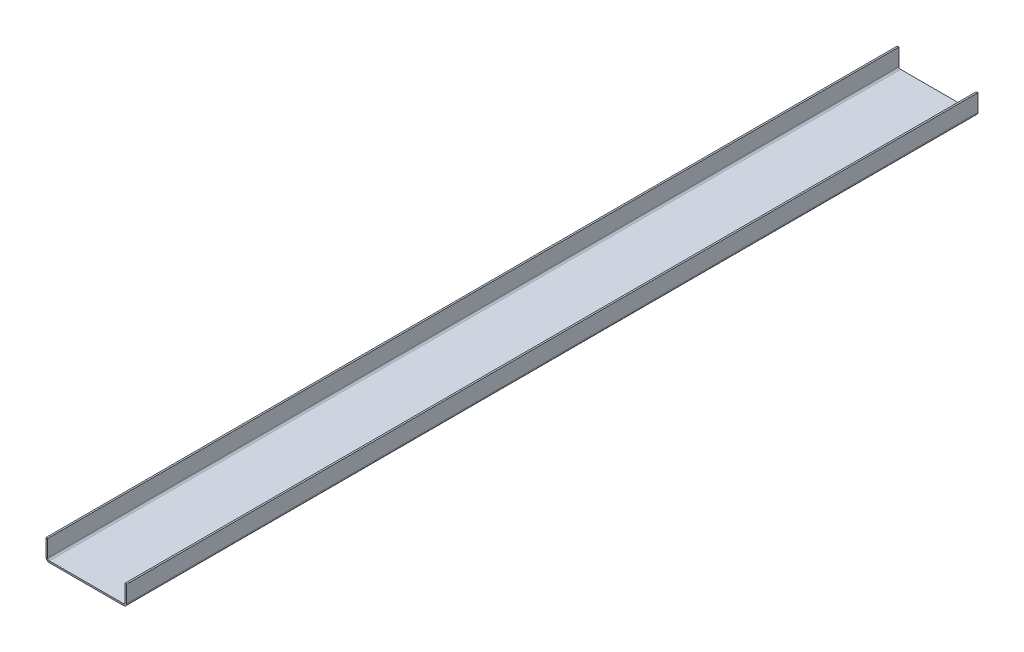
ISO-10303-21;
HEADER;
FILE_DESCRIPTION(('STEP AP214'),'2;1');
FILE_NAME('part.step','',(''),(''),'','','');
FILE_SCHEMA(('AUTOMOTIVE_DESIGN { 1 0 10303 214 1 1 1 1 }'));
ENDSEC;
DATA;
#1=APPLICATION_CONTEXT('core data for automotive mechanical design processes');
#2=APPLICATION_PROTOCOL_DEFINITION('international standard','automotive_design',2000,#1);
#3=PRODUCT_CONTEXT('',#1,'mechanical');
#4=PRODUCT('Part','Part','',(#3));
#5=PRODUCT_RELATED_PRODUCT_CATEGORY('part','',(#4));
#6=PRODUCT_DEFINITION_FORMATION('','',#4);
#7=PRODUCT_DEFINITION_CONTEXT('part definition',#1,'design');
#8=PRODUCT_DEFINITION('design','',#6,#7);
#9=PRODUCT_DEFINITION_SHAPE('','',#8);
#10=(LENGTH_UNIT() NAMED_UNIT(*) SI_UNIT(.MILLI.,.METRE.));
#11=(NAMED_UNIT(*) PLANE_ANGLE_UNIT() SI_UNIT($,.RADIAN.));
#12=(NAMED_UNIT(*) SI_UNIT($,.STERADIAN.) SOLID_ANGLE_UNIT());
#13=UNCERTAINTY_MEASURE_WITH_UNIT(LENGTH_MEASURE(1.E-05),#10,'distance_accuracy_value','');
#14=(GEOMETRIC_REPRESENTATION_CONTEXT(3) GLOBAL_UNCERTAINTY_ASSIGNED_CONTEXT((#13)) GLOBAL_UNIT_ASSIGNED_CONTEXT((#10,
#11,#12)) REPRESENTATION_CONTEXT('',''));
#15=CARTESIAN_POINT('',(0.,0.,0.));
#16=DIRECTION('',(0.,0.,1.));
#17=DIRECTION('',(1.,0.,0.));
#18=AXIS2_PLACEMENT_3D('',#15,#16,#17);
#19=CARTESIAN_POINT('',(0.,4.,1055.));
#20=DIRECTION('',(0.,0.,1.));
#21=DIRECTION('',(1.,0.,0.));
#22=AXIS2_PLACEMENT_3D('',#19,#20,#21);
#23=PLANE('',#22);
#24=DIRECTION('',(1.,0.,0.));
#25=VECTOR('',#24,1.);
#26=CARTESIAN_POINT('',(0.,4.,1055.));
#27=LINE('',#26,#25);
#28=CARTESIAN_POINT('',(0.,4.,1055.));
#29=VERTEX_POINT('',#28);
#30=CARTESIAN_POINT('',(2.,4.,1055.));
#31=VERTEX_POINT('',#30);
#32=EDGE_CURVE('E11',#29,#31,#27,.T.);
#33=ORIENTED_EDGE('',*,*,#32,.F.);
#34=CARTESIAN_POINT('',(4.,4.,1055.));
#35=DIRECTION('',(0.,0.,-1.));
#36=DIRECTION('',(-1.,0.,0.));
#37=AXIS2_PLACEMENT_3D('',#34,#35,#36);
#38=CIRCLE('',#37,4.);
#39=CARTESIAN_POINT('',(4.,0.,1055.));
#40=VERTEX_POINT('',#39);
#41=EDGE_CURVE('E146',#29,#40,#38,.F.);
#42=ORIENTED_EDGE('',*,*,#41,.T.);
#43=DIRECTION('',(0.,-1.,0.));
#44=VECTOR('',#43,1.);
#45=CARTESIAN_POINT('',(4.,2.,1055.));
#46=LINE('',#45,#44);
#47=CARTESIAN_POINT('',(4.,2.,1055.));
#48=VERTEX_POINT('',#47);
#49=EDGE_CURVE('E44',#48,#40,#46,.T.);
#50=ORIENTED_EDGE('',*,*,#49,.F.);
#51=CARTESIAN_POINT('',(4.,4.,1055.));
#52=DIRECTION('',(0.,0.,1.));
#53=DIRECTION('',(1.,0.,0.));
#54=AXIS2_PLACEMENT_3D('',#51,#52,#53);
#55=CIRCLE('',#54,2.);
#56=EDGE_CURVE('E240',#31,#48,#55,.T.);
#57=ORIENTED_EDGE('',*,*,#56,.F.);
#58=EDGE_LOOP('',(#33,#42,#50,#57));
#59=FACE_BOUND('',#58,.T.);
#60=ADVANCED_FACE('F36',(#59),#23,.T.);
#61=CARTESIAN_POINT('',(4.,2.,1055.));
#62=DIRECTION('',(0.,0.,1.));
#63=DIRECTION('',(1.,0.,0.));
#64=AXIS2_PLACEMENT_3D('',#61,#62,#63);
#65=PLANE('',#64);
#66=DIRECTION('',(0.,-1.,0.));
#67=VECTOR('',#66,1.);
#68=CARTESIAN_POINT('',(0.,25.,1055.));
#69=LINE('',#68,#67);
#70=CARTESIAN_POINT('',(0.,25.,1055.));
#71=VERTEX_POINT('',#70);
#72=EDGE_CURVE('E151',#71,#29,#69,.T.);
#73=ORIENTED_EDGE('',*,*,#72,.T.);
#74=ORIENTED_EDGE('',*,*,#32,.T.);
#75=DIRECTION('',(0.,-1.,0.));
#76=VECTOR('',#75,1.);
#77=CARTESIAN_POINT('',(2.,25.,1055.));
#78=LINE('',#77,#76);
#79=CARTESIAN_POINT('',(2.,25.,1055.));
#80=VERTEX_POINT('',#79);
#81=EDGE_CURVE('E253',#80,#31,#78,.T.);
#82=ORIENTED_EDGE('',*,*,#81,.F.);
#83=DIRECTION('',(1.,0.,0.));
#84=VECTOR('',#83,1.);
#85=CARTESIAN_POINT('',(0.,25.,1055.));
#86=LINE('',#85,#84);
#87=EDGE_CURVE('E255',#71,#80,#86,.T.);
#88=ORIENTED_EDGE('',*,*,#87,.F.);
#89=EDGE_LOOP('',(#73,#74,#82,#88));
#90=FACE_BOUND('',#89,.T.);
#91=ADVANCED_FACE('F266',(#90),#65,.T.);
#92=CARTESIAN_POINT('',(4.,0.,0.));
#93=DIRECTION('',(0.,0.,-1.));
#94=DIRECTION('',(-1.,0.,0.));
#95=AXIS2_PLACEMENT_3D('',#92,#93,#94);
#96=PLANE('',#95);
#97=DIRECTION('',(0.,1.,0.));
#98=VECTOR('',#97,1.);
#99=CARTESIAN_POINT('',(4.,0.,0.));
#100=LINE('',#99,#98);
#101=CARTESIAN_POINT('',(4.,0.,0.));
#102=VERTEX_POINT('',#101);
#103=CARTESIAN_POINT('',(4.,2.,0.));
#104=VERTEX_POINT('',#103);
#105=EDGE_CURVE('E144',#102,#104,#100,.T.);
#106=ORIENTED_EDGE('',*,*,#105,.F.);
#107=CARTESIAN_POINT('',(4.,4.,0.));
#108=DIRECTION('',(0.,0.,-1.));
#109=DIRECTION('',(-1.,0.,0.));
#110=AXIS2_PLACEMENT_3D('',#107,#108,#109);
#111=CIRCLE('',#110,4.);
#112=CARTESIAN_POINT('',(0.,4.,0.));
#113=VERTEX_POINT('',#112);
#114=EDGE_CURVE('E158',#113,#102,#111,.F.);
#115=ORIENTED_EDGE('',*,*,#114,.F.);
#116=DIRECTION('',(-1.,0.,0.));
#117=VECTOR('',#116,1.);
#118=CARTESIAN_POINT('',(2.,4.,0.));
#119=LINE('',#118,#117);
#120=CARTESIAN_POINT('',(2.,4.,0.));
#121=VERTEX_POINT('',#120);
#122=EDGE_CURVE('E231',#121,#113,#119,.T.);
#123=ORIENTED_EDGE('',*,*,#122,.F.);
#124=CARTESIAN_POINT('',(4.,4.,0.));
#125=DIRECTION('',(0.,0.,1.));
#126=DIRECTION('',(1.,0.,0.));
#127=AXIS2_PLACEMENT_3D('',#124,#125,#126);
#128=CIRCLE('',#127,2.);
#129=EDGE_CURVE('E185',#121,#104,#128,.T.);
#130=ORIENTED_EDGE('',*,*,#129,.T.);
#131=EDGE_LOOP('',(#106,#115,#123,#130));
#132=FACE_BOUND('',#131,.T.);
#133=ADVANCED_FACE('F245',(#132),#96,.T.);
#134=CARTESIAN_POINT('',(2.,4.,0.));
#135=DIRECTION('',(0.,0.,-1.));
#136=DIRECTION('',(-1.,0.,0.));
#137=AXIS2_PLACEMENT_3D('',#134,#135,#136);
#138=PLANE('',#137);
#139=DIRECTION('',(1.,0.,0.));
#140=VECTOR('',#139,1.);
#141=CARTESIAN_POINT('',(0.,0.,0.));
#142=LINE('',#141,#140);
#143=CARTESIAN_POINT('',(96.,0.,0.));
#144=VERTEX_POINT('',#143);
#145=EDGE_CURVE('E198',#102,#144,#142,.T.);
#146=ORIENTED_EDGE('',*,*,#145,.F.);
#147=ORIENTED_EDGE('',*,*,#105,.T.);
#148=DIRECTION('',(1.,0.,0.));
#149=VECTOR('',#148,1.);
#150=CARTESIAN_POINT('',(0.,2.,0.));
#151=LINE('',#150,#149);
#152=CARTESIAN_POINT('',(96.,2.,0.));
#153=VERTEX_POINT('',#152);
#154=EDGE_CURVE('E183',#104,#153,#151,.T.);
#155=ORIENTED_EDGE('',*,*,#154,.T.);
#156=DIRECTION('',(0.,-1.,0.));
#157=VECTOR('',#156,1.);
#158=CARTESIAN_POINT('',(96.,2.,0.));
#159=LINE('',#158,#157);
#160=EDGE_CURVE('E93',#153,#144,#159,.T.);
#161=ORIENTED_EDGE('',*,*,#160,.T.);
#162=EDGE_LOOP('',(#146,#147,#155,#161));
#163=FACE_BOUND('',#162,.T.);
#164=ADVANCED_FACE('F233',(#163),#138,.T.);
#165=CARTESIAN_POINT('',(96.,0.,1055.));
#166=DIRECTION('',(0.,0.,1.));
#167=DIRECTION('',(1.,0.,0.));
#168=AXIS2_PLACEMENT_3D('',#165,#166,#167);
#169=PLANE('',#168);
#170=DIRECTION('',(0.,1.,0.));
#171=VECTOR('',#170,1.);
#172=CARTESIAN_POINT('',(96.,0.,1055.));
#173=LINE('',#172,#171);
#174=CARTESIAN_POINT('',(96.,0.,1055.));
#175=VERTEX_POINT('',#174);
#176=CARTESIAN_POINT('',(96.,2.,1055.));
#177=VERTEX_POINT('',#176);
#178=EDGE_CURVE('E229',#175,#177,#173,.T.);
#179=ORIENTED_EDGE('',*,*,#178,.F.);
#180=CARTESIAN_POINT('',(96.,4.,1055.));
#181=DIRECTION('',(0.,0.,-1.));
#182=DIRECTION('',(-1.,0.,0.));
#183=AXIS2_PLACEMENT_3D('',#180,#181,#182);
#184=CIRCLE('',#183,4.);
#185=CARTESIAN_POINT('',(100.,4.,1055.));
#186=VERTEX_POINT('',#185);
#187=EDGE_CURVE('E166',#175,#186,#184,.F.);
#188=ORIENTED_EDGE('',*,*,#187,.T.);
#189=DIRECTION('',(1.,0.,0.));
#190=VECTOR('',#189,1.);
#191=CARTESIAN_POINT('',(98.,4.,1055.));
#192=LINE('',#191,#190);
#193=CARTESIAN_POINT('',(98.,4.,1055.));
#194=VERTEX_POINT('',#193);
#195=EDGE_CURVE('E52',#194,#186,#192,.T.);
#196=ORIENTED_EDGE('',*,*,#195,.F.);
#197=CARTESIAN_POINT('',(96.,4.,1055.));
#198=DIRECTION('',(0.,0.,1.));
#199=DIRECTION('',(1.,0.,0.));
#200=AXIS2_PLACEMENT_3D('',#197,#198,#199);
#201=CIRCLE('',#200,2.);
#202=EDGE_CURVE('E257',#177,#194,#201,.T.);
#203=ORIENTED_EDGE('',*,*,#202,.F.);
#204=EDGE_LOOP('',(#179,#188,#196,#203));
#205=FACE_BOUND('',#204,.T.);
#206=ADVANCED_FACE('F292',(#205),#169,.T.);
#207=CARTESIAN_POINT('',(98.,4.,1055.));
#208=DIRECTION('',(0.,0.,1.));
#209=DIRECTION('',(1.,0.,0.));
#210=AXIS2_PLACEMENT_3D('',#207,#208,#209);
#211=PLANE('',#210);
#212=DIRECTION('',(1.,0.,0.));
#213=VECTOR('',#212,1.);
#214=CARTESIAN_POINT('',(0.,0.,1055.));
#215=LINE('',#214,#213);
#216=EDGE_CURVE('E136',#40,#175,#215,.T.);
#217=ORIENTED_EDGE('',*,*,#216,.T.);
#218=ORIENTED_EDGE('',*,*,#178,.T.);
#219=DIRECTION('',(1.,0.,0.));
#220=VECTOR('',#219,1.);
#221=CARTESIAN_POINT('',(0.,2.,1055.));
#222=LINE('',#221,#220);
#223=EDGE_CURVE('E139',#48,#177,#222,.T.);
#224=ORIENTED_EDGE('',*,*,#223,.F.);
#225=ORIENTED_EDGE('',*,*,#49,.T.);
#226=EDGE_LOOP('',(#217,#218,#224,#225));
#227=FACE_BOUND('',#226,.T.);
#228=ADVANCED_FACE('F134',(#227),#211,.T.);
#229=CARTESIAN_POINT('',(100.,4.,0.));
#230=DIRECTION('',(0.,0.,-1.));
#231=DIRECTION('',(-1.,0.,0.));
#232=AXIS2_PLACEMENT_3D('',#229,#230,#231);
#233=PLANE('',#232);
#234=DIRECTION('',(-1.,0.,0.));
#235=VECTOR('',#234,1.);
#236=CARTESIAN_POINT('',(100.,4.,0.));
#237=LINE('',#236,#235);
#238=CARTESIAN_POINT('',(100.,4.,0.));
#239=VERTEX_POINT('',#238);
#240=CARTESIAN_POINT('',(98.,4.,0.));
#241=VERTEX_POINT('',#240);
#242=EDGE_CURVE('E100',#239,#241,#237,.T.);
#243=ORIENTED_EDGE('',*,*,#242,.F.);
#244=CARTESIAN_POINT('',(96.,4.,0.));
#245=DIRECTION('',(0.,0.,-1.));
#246=DIRECTION('',(-1.,0.,0.));
#247=AXIS2_PLACEMENT_3D('',#244,#245,#246);
#248=CIRCLE('',#247,4.);
#249=EDGE_CURVE('E200',#144,#239,#248,.F.);
#250=ORIENTED_EDGE('',*,*,#249,.F.);
#251=ORIENTED_EDGE('',*,*,#160,.F.);
#252=CARTESIAN_POINT('',(96.,4.,0.));
#253=DIRECTION('',(0.,0.,1.));
#254=DIRECTION('',(1.,0.,0.));
#255=AXIS2_PLACEMENT_3D('',#252,#253,#254);
#256=CIRCLE('',#255,2.);
#257=EDGE_CURVE('E181',#153,#241,#256,.T.);
#258=ORIENTED_EDGE('',*,*,#257,.T.);
#259=EDGE_LOOP('',(#243,#250,#251,#258));
#260=FACE_BOUND('',#259,.T.);
#261=ADVANCED_FACE('F298',(#260),#233,.T.);
#262=CARTESIAN_POINT('',(96.,2.,0.));
#263=DIRECTION('',(0.,0.,-1.));
#264=DIRECTION('',(-1.,0.,0.));
#265=AXIS2_PLACEMENT_3D('',#262,#263,#264);
#266=PLANE('',#265);
#267=DIRECTION('',(0.,1.,0.));
#268=VECTOR('',#267,1.);
#269=CARTESIAN_POINT('',(100.,0.,0.));
#270=LINE('',#269,#268);
#271=CARTESIAN_POINT('',(100.,25.,0.));
#272=VERTEX_POINT('',#271);
#273=EDGE_CURVE('E172',#239,#272,#270,.T.);
#274=ORIENTED_EDGE('',*,*,#273,.F.);
#275=ORIENTED_EDGE('',*,*,#242,.T.);
#276=DIRECTION('',(0.,1.,0.));
#277=VECTOR('',#276,1.);
#278=CARTESIAN_POINT('',(98.,0.,0.));
#279=LINE('',#278,#277);
#280=CARTESIAN_POINT('',(98.,25.,0.));
#281=VERTEX_POINT('',#280);
#282=EDGE_CURVE('E178',#241,#281,#279,.T.);
#283=ORIENTED_EDGE('',*,*,#282,.T.);
#284=DIRECTION('',(1.,0.,0.));
#285=VECTOR('',#284,1.);
#286=CARTESIAN_POINT('',(98.,25.,0.));
#287=LINE('',#286,#285);
#288=EDGE_CURVE('E175',#281,#272,#287,.T.);
#289=ORIENTED_EDGE('',*,*,#288,.T.);
#290=EDGE_LOOP('',(#274,#275,#283,#289));
#291=FACE_BOUND('',#290,.T.);
#292=ADVANCED_FACE('F301',(#291),#266,.T.);
#293=CARTESIAN_POINT('',(100.,0.,1055.));
#294=DIRECTION('',(-1.,0.,0.));
#295=DIRECTION('',(0.,0.,1.));
#296=AXIS2_PLACEMENT_3D('',#293,#294,#295);
#297=PLANE('',#296);
#298=ORIENTED_EDGE('',*,*,#273,.T.);
#299=DIRECTION('',(0.,0.,-1.));
#300=VECTOR('',#299,1.);
#301=CARTESIAN_POINT('',(100.,25.,1055.));
#302=LINE('',#301,#300);
#303=CARTESIAN_POINT('',(100.,25.,1055.));
#304=VERTEX_POINT('',#303);
#305=EDGE_CURVE('E224',#304,#272,#302,.T.);
#306=ORIENTED_EDGE('',*,*,#305,.F.);
#307=DIRECTION('',(0.,1.,0.));
#308=VECTOR('',#307,1.);
#309=CARTESIAN_POINT('',(100.,0.,1055.));
#310=LINE('',#309,#308);
#311=EDGE_CURVE('E106',#186,#304,#310,.T.);
#312=ORIENTED_EDGE('',*,*,#311,.F.);
#313=DIRECTION('',(0.,0.,-1.));
#314=VECTOR('',#313,1.);
#315=CARTESIAN_POINT('',(100.,4.,1055.));
#316=LINE('',#315,#314);
#317=EDGE_CURVE('E168',#186,#239,#316,.T.);
#318=ORIENTED_EDGE('',*,*,#317,.T.);
#319=EDGE_LOOP('',(#298,#306,#312,#318));
#320=FACE_BOUND('',#319,.T.);
#321=ADVANCED_FACE('F304',(#320),#297,.F.);
#322=CARTESIAN_POINT('',(98.,25.,1055.));
#323=DIRECTION('',(0.,1.,0.));
#324=DIRECTION('',(0.,0.,1.));
#325=AXIS2_PLACEMENT_3D('',#322,#323,#324);
#326=PLANE('',#325);
#327=ORIENTED_EDGE('',*,*,#288,.F.);
#328=DIRECTION('',(0.,0.,-1.));
#329=VECTOR('',#328,1.);
#330=CARTESIAN_POINT('',(98.,25.,1055.));
#331=LINE('',#330,#329);
#332=CARTESIAN_POINT('',(98.,25.,1055.));
#333=VERTEX_POINT('',#332);
#334=EDGE_CURVE('E222',#333,#281,#331,.T.);
#335=ORIENTED_EDGE('',*,*,#334,.F.);
#336=DIRECTION('',(1.,0.,0.));
#337=VECTOR('',#336,1.);
#338=CARTESIAN_POINT('',(98.,25.,1055.));
#339=LINE('',#338,#337);
#340=EDGE_CURVE('E512',#333,#304,#339,.T.);
#341=ORIENTED_EDGE('',*,*,#340,.T.);
#342=ORIENTED_EDGE('',*,*,#305,.T.);
#343=EDGE_LOOP('',(#327,#335,#341,#342));
#344=FACE_BOUND('',#343,.T.);
#345=ADVANCED_FACE('F308',(#344),#326,.T.);
#346=CARTESIAN_POINT('',(98.,0.,1055.));
#347=DIRECTION('',(-1.,0.,0.));
#348=DIRECTION('',(0.,0.,1.));
#349=AXIS2_PLACEMENT_3D('',#346,#347,#348);
#350=PLANE('',#349);
#351=ORIENTED_EDGE('',*,*,#282,.F.);
#352=DIRECTION('',(0.,0.,-1.));
#353=VECTOR('',#352,1.);
#354=CARTESIAN_POINT('',(98.,4.,1055.));
#355=LINE('',#354,#353);
#356=EDGE_CURVE('E219',#194,#241,#355,.T.);
#357=ORIENTED_EDGE('',*,*,#356,.F.);
#358=DIRECTION('',(0.,1.,0.));
#359=VECTOR('',#358,1.);
#360=CARTESIAN_POINT('',(98.,0.,1055.));
#361=LINE('',#360,#359);
#362=EDGE_CURVE('E514',#194,#333,#361,.T.);
#363=ORIENTED_EDGE('',*,*,#362,.T.);
#364=ORIENTED_EDGE('',*,*,#334,.T.);
#365=EDGE_LOOP('',(#351,#357,#363,#364));
#366=FACE_BOUND('',#365,.T.);
#367=ADVANCED_FACE('F312',(#366),#350,.T.);
#368=CARTESIAN_POINT('',(96.,4.,1055.));
#369=DIRECTION('',(0.,0.,-1.));
#370=DIRECTION('',(-1.,0.,0.));
#371=AXIS2_PLACEMENT_3D('',#368,#369,#370);
#372=CYLINDRICAL_SURFACE('',#371,2.);
#373=ORIENTED_EDGE('',*,*,#257,.F.);
#374=DIRECTION('',(0.,0.,-1.));
#375=VECTOR('',#374,1.);
#376=CARTESIAN_POINT('',(96.,2.,1055.));
#377=LINE('',#376,#375);
#378=EDGE_CURVE('E216',#177,#153,#377,.T.);
#379=ORIENTED_EDGE('',*,*,#378,.F.);
#380=ORIENTED_EDGE('',*,*,#202,.T.);
#381=ORIENTED_EDGE('',*,*,#356,.T.);
#382=EDGE_LOOP('',(#373,#379,#380,#381));
#383=FACE_BOUND('',#382,.T.);
#384=ADVANCED_FACE('F316',(#383),#372,.F.);
#385=CARTESIAN_POINT('',(0.,2.,1055.));
#386=DIRECTION('',(0.,1.,0.));
#387=DIRECTION('',(0.,0.,1.));
#388=AXIS2_PLACEMENT_3D('',#385,#386,#387);
#389=PLANE('',#388);
#390=ORIENTED_EDGE('',*,*,#154,.F.);
#391=DIRECTION('',(0.,0.,-1.));
#392=VECTOR('',#391,1.);
#393=CARTESIAN_POINT('',(4.,2.,1055.));
#394=LINE('',#393,#392);
#395=EDGE_CURVE('E213',#48,#104,#394,.T.);
#396=ORIENTED_EDGE('',*,*,#395,.F.);
#397=ORIENTED_EDGE('',*,*,#223,.T.);
#398=ORIENTED_EDGE('',*,*,#378,.T.);
#399=EDGE_LOOP('',(#390,#396,#397,#398));
#400=FACE_BOUND('',#399,.T.);
#401=ADVANCED_FACE('F242',(#400),#389,.T.);
#402=CARTESIAN_POINT('',(4.,4.,1055.));
#403=DIRECTION('',(0.,0.,-1.));
#404=DIRECTION('',(-1.,0.,0.));
#405=AXIS2_PLACEMENT_3D('',#402,#403,#404);
#406=CYLINDRICAL_SURFACE('',#405,2.);
#407=ORIENTED_EDGE('',*,*,#129,.F.);
#408=DIRECTION('',(0.,0.,-1.));
#409=VECTOR('',#408,1.);
#410=CARTESIAN_POINT('',(2.,4.,1055.));
#411=LINE('',#410,#409);
#412=EDGE_CURVE('E210',#31,#121,#411,.T.);
#413=ORIENTED_EDGE('',*,*,#412,.F.);
#414=ORIENTED_EDGE('',*,*,#56,.T.);
#415=ORIENTED_EDGE('',*,*,#395,.T.);
#416=EDGE_LOOP('',(#407,#413,#414,#415));
#417=FACE_BOUND('',#416,.T.);
#418=ADVANCED_FACE('F238',(#417),#406,.F.);
#419=CARTESIAN_POINT('',(2.,25.,1055.));
#420=DIRECTION('',(1.,0.,0.));
#421=DIRECTION('',(0.,1.,0.));
#422=AXIS2_PLACEMENT_3D('',#419,#420,#421);
#423=PLANE('',#422);
#424=DIRECTION('',(0.,-1.,0.));
#425=VECTOR('',#424,1.);
#426=CARTESIAN_POINT('',(2.,25.,0.));
#427=LINE('',#426,#425);
#428=CARTESIAN_POINT('',(2.,25.,0.));
#429=VERTEX_POINT('',#428);
#430=EDGE_CURVE('E188',#429,#121,#427,.T.);
#431=ORIENTED_EDGE('',*,*,#430,.F.);
#432=DIRECTION('',(0.,0.,-1.));
#433=VECTOR('',#432,1.);
#434=CARTESIAN_POINT('',(2.,25.,1055.));
#435=LINE('',#434,#433);
#436=EDGE_CURVE('E208',#80,#429,#435,.T.);
#437=ORIENTED_EDGE('',*,*,#436,.F.);
#438=ORIENTED_EDGE('',*,*,#81,.T.);
#439=ORIENTED_EDGE('',*,*,#412,.T.);
#440=EDGE_LOOP('',(#431,#437,#438,#439));
#441=FACE_BOUND('',#440,.T.);
#442=ADVANCED_FACE('F251',(#441),#423,.T.);
#443=CARTESIAN_POINT('',(0.,25.,1055.));
#444=DIRECTION('',(0.,1.,0.));
#445=DIRECTION('',(0.,0.,1.));
#446=AXIS2_PLACEMENT_3D('',#443,#444,#445);
#447=PLANE('',#446);
#448=DIRECTION('',(1.,0.,0.));
#449=VECTOR('',#448,1.);
#450=CARTESIAN_POINT('',(0.,25.,0.));
#451=LINE('',#450,#449);
#452=CARTESIAN_POINT('',(0.,25.,0.));
#453=VERTEX_POINT('',#452);
#454=EDGE_CURVE('E191',#453,#429,#451,.T.);
#455=ORIENTED_EDGE('',*,*,#454,.F.);
#456=DIRECTION('',(0.,0.,-1.));
#457=VECTOR('',#456,1.);
#458=CARTESIAN_POINT('',(0.,25.,1055.));
#459=LINE('',#458,#457);
#460=EDGE_CURVE('E206',#71,#453,#459,.T.);
#461=ORIENTED_EDGE('',*,*,#460,.F.);
#462=ORIENTED_EDGE('',*,*,#87,.T.);
#463=ORIENTED_EDGE('',*,*,#436,.T.);
#464=EDGE_LOOP('',(#455,#461,#462,#463));
#465=FACE_BOUND('',#464,.T.);
#466=ADVANCED_FACE('F272',(#465),#447,.T.);
#467=CARTESIAN_POINT('',(0.,25.,1055.));
#468=DIRECTION('',(1.,0.,0.));
#469=DIRECTION('',(0.,1.,0.));
#470=AXIS2_PLACEMENT_3D('',#467,#468,#469);
#471=PLANE('',#470);
#472=DIRECTION('',(0.,-1.,0.));
#473=VECTOR('',#472,1.);
#474=CARTESIAN_POINT('',(0.,25.,0.));
#475=LINE('',#474,#473);
#476=EDGE_CURVE('E194',#453,#113,#475,.T.);
#477=ORIENTED_EDGE('',*,*,#476,.T.);
#478=DIRECTION('',(0.,0.,-1.));
#479=VECTOR('',#478,1.);
#480=CARTESIAN_POINT('',(0.,4.,1055.));
#481=LINE('',#480,#479);
#482=EDGE_CURVE('E160',#29,#113,#481,.T.);
#483=ORIENTED_EDGE('',*,*,#482,.F.);
#484=ORIENTED_EDGE('',*,*,#72,.F.);
#485=ORIENTED_EDGE('',*,*,#460,.T.);
#486=EDGE_LOOP('',(#477,#483,#484,#485));
#487=FACE_BOUND('',#486,.T.);
#488=ADVANCED_FACE('F268',(#487),#471,.F.);
#489=CARTESIAN_POINT('',(4.,4.,1055.));
#490=DIRECTION('',(0.,0.,-1.));
#491=DIRECTION('',(-1.,0.,0.));
#492=AXIS2_PLACEMENT_3D('',#489,#490,#491);
#493=CYLINDRICAL_SURFACE('',#492,4.);
#494=ORIENTED_EDGE('',*,*,#114,.T.);
#495=DIRECTION('',(0.,0.,-1.));
#496=VECTOR('',#495,1.);
#497=CARTESIAN_POINT('',(4.,0.,1055.));
#498=LINE('',#497,#496);
#499=EDGE_CURVE('E155',#40,#102,#498,.T.);
#500=ORIENTED_EDGE('',*,*,#499,.F.);
#501=ORIENTED_EDGE('',*,*,#41,.F.);
#502=ORIENTED_EDGE('',*,*,#482,.T.);
#503=EDGE_LOOP('',(#494,#500,#501,#502));
#504=FACE_BOUND('',#503,.T.);
#505=ADVANCED_FACE('F156',(#504),#493,.T.);
#506=CARTESIAN_POINT('',(0.,0.,1055.));
#507=DIRECTION('',(0.,1.,0.));
#508=DIRECTION('',(0.,0.,1.));
#509=AXIS2_PLACEMENT_3D('',#506,#507,#508);
#510=PLANE('',#509);
#511=ORIENTED_EDGE('',*,*,#145,.T.);
#512=DIRECTION('',(0.,0.,-1.));
#513=VECTOR('',#512,1.);
#514=CARTESIAN_POINT('',(96.,0.,1055.));
#515=LINE('',#514,#513);
#516=EDGE_CURVE('E161',#175,#144,#515,.T.);
#517=ORIENTED_EDGE('',*,*,#516,.F.);
#518=ORIENTED_EDGE('',*,*,#216,.F.);
#519=ORIENTED_EDGE('',*,*,#499,.T.);
#520=EDGE_LOOP('',(#511,#517,#518,#519));
#521=FACE_BOUND('',#520,.T.);
#522=ADVANCED_FACE('F163',(#521),#510,.F.);
#523=CARTESIAN_POINT('',(96.,4.,1055.));
#524=DIRECTION('',(0.,0.,-1.));
#525=DIRECTION('',(-1.,0.,0.));
#526=AXIS2_PLACEMENT_3D('',#523,#524,#525);
#527=CYLINDRICAL_SURFACE('',#526,4.);
#528=ORIENTED_EDGE('',*,*,#249,.T.);
#529=ORIENTED_EDGE('',*,*,#317,.F.);
#530=ORIENTED_EDGE('',*,*,#187,.F.);
#531=ORIENTED_EDGE('',*,*,#516,.T.);
#532=EDGE_LOOP('',(#528,#529,#530,#531));
#533=FACE_BOUND('',#532,.T.);
#534=ADVANCED_FACE('F363',(#533),#527,.T.);
#535=CARTESIAN_POINT('',(96.,4.,1055.));
#536=DIRECTION('',(0.,0.,1.));
#537=DIRECTION('',(1.,0.,0.));
#538=AXIS2_PLACEMENT_3D('',#535,#536,#537);
#539=PLANE('',#538);
#540=ORIENTED_EDGE('',*,*,#311,.T.);
#541=ORIENTED_EDGE('',*,*,#340,.F.);
#542=ORIENTED_EDGE('',*,*,#362,.F.);
#543=ORIENTED_EDGE('',*,*,#195,.T.);
#544=EDGE_LOOP('',(#540,#541,#542,#543));
#545=FACE_BOUND('',#544,.T.);
#546=ADVANCED_FACE('F373',(#545),#539,.T.);
#547=CARTESIAN_POINT('',(96.,4.,0.));
#548=DIRECTION('',(0.,0.,1.));
#549=DIRECTION('',(1.,0.,0.));
#550=AXIS2_PLACEMENT_3D('',#547,#548,#549);
#551=PLANE('',#550);
#552=ORIENTED_EDGE('',*,*,#430,.T.);
#553=ORIENTED_EDGE('',*,*,#122,.T.);
#554=ORIENTED_EDGE('',*,*,#476,.F.);
#555=ORIENTED_EDGE('',*,*,#454,.T.);
#556=EDGE_LOOP('',(#552,#553,#554,#555));
#557=FACE_BOUND('',#556,.T.);
#558=ADVANCED_FACE('F270',(#557),#551,.F.);
#559=CLOSED_SHELL('',(#60,#91,#133,#164,#206,#228,#261,#292,#321,#345,#367,#384,#401,#418,#442,
#466,#488,#505,#522,#534,#546,#558));
#560=MANIFOLD_SOLID_BREP('B2',#559);
#561=ADVANCED_BREP_SHAPE_REPRESENTATION('',(#18,#560),#14);
#562=SHAPE_DEFINITION_REPRESENTATION(#9,#561);
ENDSEC;
END-ISO-10303-21;
